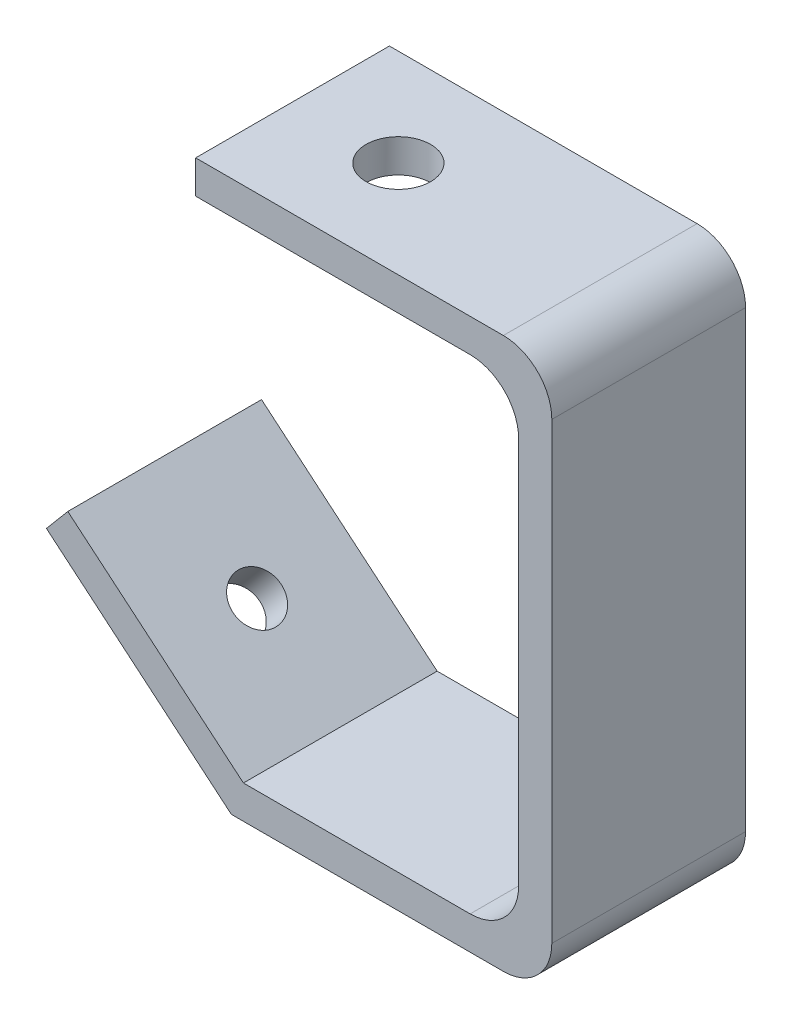
ISO-10303-21;
HEADER;
FILE_DESCRIPTION(('STEP AP214'),'2;1');
FILE_NAME('part.step','',(''),(''),'','','');
FILE_SCHEMA(('AUTOMOTIVE_DESIGN { 1 0 10303 214 1 1 1 1 }'));
ENDSEC;
DATA;
#1=APPLICATION_CONTEXT('core data for automotive mechanical design processes');
#2=APPLICATION_PROTOCOL_DEFINITION('international standard','automotive_design',2000,#1);
#3=PRODUCT_CONTEXT('',#1,'mechanical');
#4=PRODUCT('Part','Part','',(#3));
#5=PRODUCT_RELATED_PRODUCT_CATEGORY('part','',(#4));
#6=PRODUCT_DEFINITION_FORMATION('','',#4);
#7=PRODUCT_DEFINITION_CONTEXT('part definition',#1,'design');
#8=PRODUCT_DEFINITION('design','',#6,#7);
#9=PRODUCT_DEFINITION_SHAPE('','',#8);
#10=(LENGTH_UNIT() NAMED_UNIT(*) SI_UNIT(.MILLI.,.METRE.));
#11=(NAMED_UNIT(*) PLANE_ANGLE_UNIT() SI_UNIT($,.RADIAN.));
#12=(NAMED_UNIT(*) SI_UNIT($,.STERADIAN.) SOLID_ANGLE_UNIT());
#13=UNCERTAINTY_MEASURE_WITH_UNIT(LENGTH_MEASURE(1.E-05),#10,'distance_accuracy_value','');
#14=(GEOMETRIC_REPRESENTATION_CONTEXT(3) GLOBAL_UNCERTAINTY_ASSIGNED_CONTEXT((#13)) GLOBAL_UNIT_ASSIGNED_CONTEXT((#10,
#11,#12)) REPRESENTATION_CONTEXT('',''));
#15=CARTESIAN_POINT('',(0.,0.,0.));
#16=DIRECTION('',(0.,0.,1.));
#17=DIRECTION('',(1.,0.,0.));
#18=AXIS2_PLACEMENT_3D('',#15,#16,#17);
#19=CARTESIAN_POINT('',(0.,0.,38.1));
#20=DIRECTION('',(-0.642787609686535,-0.766044443118982,0.));
#21=DIRECTION('',(0.766044443118982,-0.642787609686535,0.));
#22=AXIS2_PLACEMENT_3D('',#19,#20,#21);
#23=PLANE('',#22);
#24=CARTESIAN_POINT('',(-16.36013323937,13.7277817671664,19.05));
#25=DIRECTION('',(-0.642787609686535,-0.766044443118982,0.));
#26=DIRECTION('',(0.766044443118982,-0.642787609686535,0.));
#27=AXIS2_PLACEMENT_3D('',#24,#25,#26);
#28=CIRCLE('',#27,4.765);
#29=CARTESIAN_POINT('',(-12.7099314679081,10.6648988070101,19.05));
#30=VERTEX_POINT('',#29);
#31=EDGE_CURVE('E333',#30,#30,#28,.T.);
#32=ORIENTED_EDGE('',*,*,#31,.T.);
#33=EDGE_LOOP('',(#32));
#34=FACE_BOUND('',#33,.T.);
#35=DIRECTION('',(-0.766044443118982,0.642787609686535,0.));
#36=VECTOR('',#35,1.);
#37=CARTESIAN_POINT('',(0.,0.,0.));
#38=LINE('',#37,#36);
#39=CARTESIAN_POINT('',(0.,0.,0.));
#40=VERTEX_POINT('',#39);
#41=CARTESIAN_POINT('',(-34.5409439402349,28.9832933207658,0.));
#42=VERTEX_POINT('',#41);
#43=EDGE_CURVE('E177',#40,#42,#38,.T.);
#44=ORIENTED_EDGE('',*,*,#43,.T.);
#45=DIRECTION('',(0.,0.,-1.));
#46=VECTOR('',#45,1.);
#47=CARTESIAN_POINT('',(-34.5409439402349,28.9832933207658,38.1));
#48=LINE('',#47,#46);
#49=CARTESIAN_POINT('',(-34.5409439402349,28.9832933207658,38.1));
#50=VERTEX_POINT('',#49);
#51=EDGE_CURVE('E11',#50,#42,#48,.T.);
#52=ORIENTED_EDGE('',*,*,#51,.F.);
#53=DIRECTION('',(-0.766044443118982,0.642787609686535,0.));
#54=VECTOR('',#53,1.);
#55=CARTESIAN_POINT('',(0.,0.,38.1));
#56=LINE('',#55,#54);
#57=CARTESIAN_POINT('',(0.,0.,38.1));
#58=VERTEX_POINT('',#57);
#59=EDGE_CURVE('E217',#58,#50,#56,.T.);
#60=ORIENTED_EDGE('',*,*,#59,.F.);
#61=DIRECTION('',(0.,0.,-1.));
#62=VECTOR('',#61,1.);
#63=CARTESIAN_POINT('',(0.,0.,38.1));
#64=LINE('',#63,#62);
#65=EDGE_CURVE('E173',#58,#40,#64,.T.);
#66=ORIENTED_EDGE('',*,*,#65,.T.);
#67=EDGE_LOOP('',(#44,#52,#60,#66));
#68=FACE_BOUND('',#67,.T.);
#69=ADVANCED_FACE('F39',(#34,#68),#23,.F.);
#70=CARTESIAN_POINT('',(-34.5409439402349,28.9832933207658,38.1));
#71=DIRECTION('',(0.766044443118982,-0.642787609686535,0.));
#72=DIRECTION('',(0.642787609686535,0.766044443118982,0.));
#73=AXIS2_PLACEMENT_3D('',#70,#71,#72);
#74=PLANE('',#73);
#75=DIRECTION('',(-0.642787609686535,-0.766044443118982,0.));
#76=VECTOR('',#75,1.);
#77=CARTESIAN_POINT('',(-34.5409439402349,28.9832933207658,0.));
#78=LINE('',#77,#76);
#79=CARTESIAN_POINT('',(-38.738347031488,23.9810231071989,0.));
#80=VERTEX_POINT('',#79);
#81=EDGE_CURVE('E181',#42,#80,#78,.T.);
#82=ORIENTED_EDGE('',*,*,#81,.T.);
#83=DIRECTION('',(0.,0.,-1.));
#84=VECTOR('',#83,1.);
#85=CARTESIAN_POINT('',(-38.738347031488,23.9810231071989,38.1));
#86=LINE('',#85,#84);
#87=CARTESIAN_POINT('',(-38.738347031488,23.9810231071989,38.1));
#88=VERTEX_POINT('',#87);
#89=EDGE_CURVE('E49',#88,#80,#86,.T.);
#90=ORIENTED_EDGE('',*,*,#89,.F.);
#91=DIRECTION('',(-0.642787609686535,-0.766044443118982,0.));
#92=VECTOR('',#91,1.);
#93=CARTESIAN_POINT('',(-34.5409439402349,28.9832933207658,38.1));
#94=LINE('',#93,#92);
#95=EDGE_CURVE('E118',#50,#88,#94,.T.);
#96=ORIENTED_EDGE('',*,*,#95,.F.);
#97=ORIENTED_EDGE('',*,*,#51,.T.);
#98=EDGE_LOOP('',(#82,#90,#96,#97));
#99=FACE_BOUND('',#98,.T.);
#100=ADVANCED_FACE('F326',(#99),#74,.F.);
#101=CARTESIAN_POINT('',(-2.37672562975828,-6.53,38.1));
#102=DIRECTION('',(0.642787609686535,0.766044443118982,0.));
#103=DIRECTION('',(-0.766044443118982,0.642787609686535,0.));
#104=AXIS2_PLACEMENT_3D('',#101,#102,#103);
#105=PLANE('',#104);
#106=CARTESIAN_POINT('',(-20.5575363306231,8.72551155359944,19.05));
#107=DIRECTION('',(-0.642787609686535,-0.766044443118982,0.));
#108=DIRECTION('',(0.766044443118982,-0.642787609686535,0.));
#109=AXIS2_PLACEMENT_3D('',#106,#107,#108);
#110=CIRCLE('',#109,4.765);
#111=CARTESIAN_POINT('',(-16.9073345591612,5.6626285934431,19.05));
#112=VERTEX_POINT('',#111);
#113=EDGE_CURVE('E337',#112,#112,#110,.T.);
#114=ORIENTED_EDGE('',*,*,#113,.F.);
#115=EDGE_LOOP('',(#114));
#116=FACE_BOUND('',#115,.T.);
#117=DIRECTION('',(0.766044443118982,-0.642787609686535,0.));
#118=VECTOR('',#117,1.);
#119=CARTESIAN_POINT('',(-2.37672562975828,-6.53,0.));
#120=LINE('',#119,#118);
#121=CARTESIAN_POINT('',(-2.37672562975828,-6.53,0.));
#122=VERTEX_POINT('',#121);
#123=EDGE_CURVE('E184',#80,#122,#120,.T.);
#124=ORIENTED_EDGE('',*,*,#123,.T.);
#125=DIRECTION('',(0.,0.,-1.));
#126=VECTOR('',#125,1.);
#127=CARTESIAN_POINT('',(-2.37672562975828,-6.53,38.1));
#128=LINE('',#127,#126);
#129=CARTESIAN_POINT('',(-2.37672562975828,-6.53,38.1));
#130=VERTEX_POINT('',#129);
#131=EDGE_CURVE('E252',#130,#122,#128,.T.);
#132=ORIENTED_EDGE('',*,*,#131,.F.);
#133=DIRECTION('',(0.766044443118982,-0.642787609686535,0.));
#134=VECTOR('',#133,1.);
#135=CARTESIAN_POINT('',(-2.37672562975828,-6.53,38.1));
#136=LINE('',#135,#134);
#137=EDGE_CURVE('E263',#88,#130,#136,.T.);
#138=ORIENTED_EDGE('',*,*,#137,.F.);
#139=ORIENTED_EDGE('',*,*,#89,.T.);
#140=EDGE_LOOP('',(#124,#132,#138,#139));
#141=FACE_BOUND('',#140,.T.);
#142=ADVANCED_FACE('F261',(#116,#141),#105,.F.);
#143=CARTESIAN_POINT('',(-2.37672562975828,-6.53,38.1));
#144=DIRECTION('',(0.,1.,0.));
#145=DIRECTION('',(0.,0.,1.));
#146=AXIS2_PLACEMENT_3D('',#143,#144,#145);
#147=PLANE('',#146);
#148=DIRECTION('',(1.,0.,0.));
#149=VECTOR('',#148,1.);
#150=CARTESIAN_POINT('',(-2.37672562975828,-6.53,0.));
#151=LINE('',#150,#149);
#152=CARTESIAN_POINT('',(51.1209999999999,-6.53,0.));
#153=VERTEX_POINT('',#152);
#154=EDGE_CURVE('E187',#122,#153,#151,.T.);
#155=ORIENTED_EDGE('',*,*,#154,.T.);
#156=DIRECTION('',(0.,0.,-1.));
#157=VECTOR('',#156,1.);
#158=CARTESIAN_POINT('',(51.1209999999999,-6.53,38.1));
#159=LINE('',#158,#157);
#160=CARTESIAN_POINT('',(51.1209999999999,-6.53,38.1));
#161=VERTEX_POINT('',#160);
#162=EDGE_CURVE('E248',#161,#153,#159,.T.);
#163=ORIENTED_EDGE('',*,*,#162,.F.);
#164=DIRECTION('',(1.,0.,0.));
#165=VECTOR('',#164,1.);
#166=CARTESIAN_POINT('',(-2.37672562975828,-6.53,38.1));
#167=LINE('',#166,#165);
#168=EDGE_CURVE('E282',#130,#161,#167,.T.);
#169=ORIENTED_EDGE('',*,*,#168,.F.);
#170=ORIENTED_EDGE('',*,*,#131,.T.);
#171=EDGE_LOOP('',(#155,#163,#169,#170));
#172=FACE_BOUND('',#171,.T.);
#173=ADVANCED_FACE('F272',(#172),#147,.F.);
#174=CARTESIAN_POINT('',(51.121,3.,38.1));
#175=DIRECTION('',(0.,0.,-1.));
#176=DIRECTION('',(-1.,0.,0.));
#177=AXIS2_PLACEMENT_3D('',#174,#175,#176);
#178=CYLINDRICAL_SURFACE('',#177,9.53);
#179=CARTESIAN_POINT('',(51.121,3.,0.));
#180=DIRECTION('',(0.,0.,1.));
#181=DIRECTION('',(1.,0.,0.));
#182=AXIS2_PLACEMENT_3D('',#179,#180,#181);
#183=CIRCLE('',#182,9.53);
#184=CARTESIAN_POINT('',(60.651,3.00000000000007,0.));
#185=VERTEX_POINT('',#184);
#186=EDGE_CURVE('E190',#153,#185,#183,.T.);
#187=ORIENTED_EDGE('',*,*,#186,.T.);
#188=DIRECTION('',(0.,0.,-1.));
#189=VECTOR('',#188,1.);
#190=CARTESIAN_POINT('',(60.651,3.00000000000007,38.1));
#191=LINE('',#190,#189);
#192=CARTESIAN_POINT('',(60.651,3.00000000000007,38.1));
#193=VERTEX_POINT('',#192);
#194=EDGE_CURVE('E244',#193,#185,#191,.T.);
#195=ORIENTED_EDGE('',*,*,#194,.F.);
#196=CARTESIAN_POINT('',(51.121,3.,38.1));
#197=DIRECTION('',(0.,0.,1.));
#198=DIRECTION('',(1.,0.,0.));
#199=AXIS2_PLACEMENT_3D('',#196,#197,#198);
#200=CIRCLE('',#199,9.53);
#201=EDGE_CURVE('E278',#161,#193,#200,.T.);
#202=ORIENTED_EDGE('',*,*,#201,.F.);
#203=ORIENTED_EDGE('',*,*,#162,.T.);
#204=EDGE_LOOP('',(#187,#195,#202,#203));
#205=FACE_BOUND('',#204,.T.);
#206=ADVANCED_FACE('F276',(#205),#178,.T.);
#207=CARTESIAN_POINT('',(60.651,3.00000000000007,38.1));
#208=DIRECTION('',(-1.,0.,0.));
#209=DIRECTION('',(0.,0.,1.));
#210=AXIS2_PLACEMENT_3D('',#207,#208,#209);
#211=PLANE('',#210);
#212=DIRECTION('',(0.,1.,0.));
#213=VECTOR('',#212,1.);
#214=CARTESIAN_POINT('',(60.651,3.00000000000007,0.));
#215=LINE('',#214,#213);
#216=CARTESIAN_POINT('',(60.651,92.2499999999999,0.));
#217=VERTEX_POINT('',#216);
#218=EDGE_CURVE('E193',#185,#217,#215,.T.);
#219=ORIENTED_EDGE('',*,*,#218,.T.);
#220=DIRECTION('',(0.,0.,-1.));
#221=VECTOR('',#220,1.);
#222=CARTESIAN_POINT('',(60.651,92.2499999999999,38.1));
#223=LINE('',#222,#221);
#224=CARTESIAN_POINT('',(60.651,92.2499999999999,38.1));
#225=VERTEX_POINT('',#224);
#226=EDGE_CURVE('E240',#225,#217,#223,.T.);
#227=ORIENTED_EDGE('',*,*,#226,.F.);
#228=DIRECTION('',(0.,1.,0.));
#229=VECTOR('',#228,1.);
#230=CARTESIAN_POINT('',(60.651,3.00000000000007,38.1));
#231=LINE('',#230,#229);
#232=EDGE_CURVE('E281',#193,#225,#231,.T.);
#233=ORIENTED_EDGE('',*,*,#232,.F.);
#234=ORIENTED_EDGE('',*,*,#194,.T.);
#235=EDGE_LOOP('',(#219,#227,#233,#234));
#236=FACE_BOUND('',#235,.T.);
#237=ADVANCED_FACE('F391',(#236),#211,.F.);
#238=CARTESIAN_POINT('',(51.121,92.25,38.1));
#239=DIRECTION('',(0.,0.,-1.));
#240=DIRECTION('',(-1.,0.,0.));
#241=AXIS2_PLACEMENT_3D('',#238,#239,#240);
#242=CYLINDRICAL_SURFACE('',#241,9.53);
#243=CARTESIAN_POINT('',(51.121,92.25,0.));
#244=DIRECTION('',(0.,0.,1.));
#245=DIRECTION('',(1.,0.,0.));
#246=AXIS2_PLACEMENT_3D('',#243,#244,#245);
#247=CIRCLE('',#246,9.53);
#248=CARTESIAN_POINT('',(51.1209999999999,101.78,0.));
#249=VERTEX_POINT('',#248);
#250=EDGE_CURVE('E196',#217,#249,#247,.T.);
#251=ORIENTED_EDGE('',*,*,#250,.T.);
#252=DIRECTION('',(0.,0.,-1.));
#253=VECTOR('',#252,1.);
#254=CARTESIAN_POINT('',(51.1209999999999,101.78,38.1));
#255=LINE('',#254,#253);
#256=CARTESIAN_POINT('',(51.1209999999999,101.78,38.1));
#257=VERTEX_POINT('',#256);
#258=EDGE_CURVE('E236',#257,#249,#255,.T.);
#259=ORIENTED_EDGE('',*,*,#258,.F.);
#260=CARTESIAN_POINT('',(51.121,92.25,38.1));
#261=DIRECTION('',(0.,0.,1.));
#262=DIRECTION('',(1.,0.,0.));
#263=AXIS2_PLACEMENT_3D('',#260,#261,#262);
#264=CIRCLE('',#263,9.53);
#265=EDGE_CURVE('E286',#225,#257,#264,.T.);
#266=ORIENTED_EDGE('',*,*,#265,.F.);
#267=ORIENTED_EDGE('',*,*,#226,.T.);
#268=EDGE_LOOP('',(#251,#259,#266,#267));
#269=FACE_BOUND('',#268,.T.);
#270=ADVANCED_FACE('F372',(#269),#242,.T.);
#271=CARTESIAN_POINT('',(51.1209999999999,101.78,38.1));
#272=DIRECTION('',(0.,-1.,0.));
#273=DIRECTION('',(0.,0.,-1.));
#274=AXIS2_PLACEMENT_3D('',#271,#272,#273);
#275=PLANE('',#274);
#276=CARTESIAN_POINT('',(11.421,101.78,19.05));
#277=DIRECTION('',(0.,1.,0.));
#278=DIRECTION('',(0.,0.,1.));
#279=AXIS2_PLACEMENT_3D('',#276,#277,#278);
#280=CIRCLE('',#279,6.35);
#281=CARTESIAN_POINT('',(11.421,101.78,25.4));
#282=VERTEX_POINT('',#281);
#283=EDGE_CURVE('E336',#282,#282,#280,.T.);
#284=ORIENTED_EDGE('',*,*,#283,.F.);
#285=EDGE_LOOP('',(#284));
#286=FACE_BOUND('',#285,.T.);
#287=DIRECTION('',(-1.,0.,0.));
#288=VECTOR('',#287,1.);
#289=CARTESIAN_POINT('',(51.1209999999999,101.78,0.));
#290=LINE('',#289,#288);
#291=CARTESIAN_POINT('',(-9.38899999999999,101.78,0.));
#292=VERTEX_POINT('',#291);
#293=EDGE_CURVE('E199',#249,#292,#290,.T.);
#294=ORIENTED_EDGE('',*,*,#293,.T.);
#295=DIRECTION('',(0.,0.,-1.));
#296=VECTOR('',#295,1.);
#297=CARTESIAN_POINT('',(-9.38899999999999,101.78,38.1));
#298=LINE('',#297,#296);
#299=CARTESIAN_POINT('',(-9.38899999999999,101.78,38.1));
#300=VERTEX_POINT('',#299);
#301=EDGE_CURVE('E232',#300,#292,#298,.T.);
#302=ORIENTED_EDGE('',*,*,#301,.F.);
#303=DIRECTION('',(-1.,0.,0.));
#304=VECTOR('',#303,1.);
#305=CARTESIAN_POINT('',(51.1209999999999,101.78,38.1));
#306=LINE('',#305,#304);
#307=EDGE_CURVE('E293',#257,#300,#306,.T.);
#308=ORIENTED_EDGE('',*,*,#307,.F.);
#309=ORIENTED_EDGE('',*,*,#258,.T.);
#310=EDGE_LOOP('',(#294,#302,#308,#309));
#311=FACE_BOUND('',#310,.T.);
#312=ADVANCED_FACE('F368',(#286,#311),#275,.F.);
#313=CARTESIAN_POINT('',(-9.38899999999999,101.78,38.1));
#314=DIRECTION('',(1.,0.,0.));
#315=DIRECTION('',(0.,0.,-1.));
#316=AXIS2_PLACEMENT_3D('',#313,#314,#315);
#317=PLANE('',#316);
#318=DIRECTION('',(0.,-1.,0.));
#319=VECTOR('',#318,1.);
#320=CARTESIAN_POINT('',(-9.38899999999999,101.78,0.));
#321=LINE('',#320,#319);
#322=CARTESIAN_POINT('',(-9.38899999999999,95.25,0.));
#323=VERTEX_POINT('',#322);
#324=EDGE_CURVE('E202',#292,#323,#321,.T.);
#325=ORIENTED_EDGE('',*,*,#324,.T.);
#326=DIRECTION('',(0.,0.,-1.));
#327=VECTOR('',#326,1.);
#328=CARTESIAN_POINT('',(-9.38899999999999,95.25,38.1));
#329=LINE('',#328,#327);
#330=CARTESIAN_POINT('',(-9.38899999999999,95.25,38.1));
#331=VERTEX_POINT('',#330);
#332=EDGE_CURVE('E228',#331,#323,#329,.T.);
#333=ORIENTED_EDGE('',*,*,#332,.F.);
#334=DIRECTION('',(0.,-1.,0.));
#335=VECTOR('',#334,1.);
#336=CARTESIAN_POINT('',(-9.38899999999999,101.78,38.1));
#337=LINE('',#336,#335);
#338=EDGE_CURVE('E296',#300,#331,#337,.T.);
#339=ORIENTED_EDGE('',*,*,#338,.F.);
#340=ORIENTED_EDGE('',*,*,#301,.T.);
#341=EDGE_LOOP('',(#325,#333,#339,#340));
#342=FACE_BOUND('',#341,.T.);
#343=ADVANCED_FACE('F371',(#342),#317,.F.);
#344=CARTESIAN_POINT('',(44.5909999999999,95.25,38.1));
#345=DIRECTION('',(0.,1.,0.));
#346=DIRECTION('',(-1.,0.,0.));
#347=AXIS2_PLACEMENT_3D('',#344,#345,#346);
#348=PLANE('',#347);
#349=CARTESIAN_POINT('',(11.421,95.25,19.05));
#350=DIRECTION('',(0.,1.,0.));
#351=DIRECTION('',(-1.,0.,0.));
#352=AXIS2_PLACEMENT_3D('',#349,#350,#351);
#353=CIRCLE('',#352,6.35);
#354=CARTESIAN_POINT('',(5.071,95.25,19.05));
#355=VERTEX_POINT('',#354);
#356=EDGE_CURVE('E42',#355,#355,#353,.T.);
#357=ORIENTED_EDGE('',*,*,#356,.T.);
#358=EDGE_LOOP('',(#357));
#359=FACE_BOUND('',#358,.T.);
#360=DIRECTION('',(1.,0.,0.));
#361=VECTOR('',#360,1.);
#362=CARTESIAN_POINT('',(44.5909999999999,95.25,0.));
#363=LINE('',#362,#361);
#364=CARTESIAN_POINT('',(44.5909999999999,95.25,0.));
#365=VERTEX_POINT('',#364);
#366=EDGE_CURVE('E205',#323,#365,#363,.T.);
#367=ORIENTED_EDGE('',*,*,#366,.T.);
#368=DIRECTION('',(0.,0.,-1.));
#369=VECTOR('',#368,1.);
#370=CARTESIAN_POINT('',(44.5909999999999,95.25,38.1));
#371=LINE('',#370,#369);
#372=CARTESIAN_POINT('',(44.5909999999999,95.25,38.1));
#373=VERTEX_POINT('',#372);
#374=EDGE_CURVE('E224',#373,#365,#371,.T.);
#375=ORIENTED_EDGE('',*,*,#374,.F.);
#376=DIRECTION('',(1.,0.,0.));
#377=VECTOR('',#376,1.);
#378=CARTESIAN_POINT('',(44.5909999999999,95.25,38.1));
#379=LINE('',#378,#377);
#380=EDGE_CURVE('E299',#331,#373,#379,.T.);
#381=ORIENTED_EDGE('',*,*,#380,.F.);
#382=ORIENTED_EDGE('',*,*,#332,.T.);
#383=EDGE_LOOP('',(#367,#375,#381,#382));
#384=FACE_BOUND('',#383,.T.);
#385=ADVANCED_FACE('F307',(#359,#384),#348,.F.);
#386=CARTESIAN_POINT('',(44.591,85.72,38.1));
#387=DIRECTION('',(0.,0.,-1.));
#388=DIRECTION('',(-1.,0.,0.));
#389=AXIS2_PLACEMENT_3D('',#386,#387,#388);
#390=CYLINDRICAL_SURFACE('',#389,9.53);
#391=CARTESIAN_POINT('',(44.591,85.72,0.));
#392=DIRECTION('',(0.,0.,-1.));
#393=DIRECTION('',(1.,0.,0.));
#394=AXIS2_PLACEMENT_3D('',#391,#392,#393);
#395=CIRCLE('',#394,9.53);
#396=CARTESIAN_POINT('',(54.121,85.7199999999999,0.));
#397=VERTEX_POINT('',#396);
#398=EDGE_CURVE('E208',#365,#397,#395,.T.);
#399=ORIENTED_EDGE('',*,*,#398,.T.);
#400=DIRECTION('',(0.,0.,-1.));
#401=VECTOR('',#400,1.);
#402=CARTESIAN_POINT('',(54.121,85.7199999999999,38.1));
#403=LINE('',#402,#401);
#404=CARTESIAN_POINT('',(54.121,85.7199999999999,38.1));
#405=VERTEX_POINT('',#404);
#406=EDGE_CURVE('E166',#405,#397,#403,.T.);
#407=ORIENTED_EDGE('',*,*,#406,.F.);
#408=CARTESIAN_POINT('',(44.591,85.72,38.1));
#409=DIRECTION('',(0.,0.,-1.));
#410=DIRECTION('',(1.,0.,0.));
#411=AXIS2_PLACEMENT_3D('',#408,#409,#410);
#412=CIRCLE('',#411,9.53);
#413=EDGE_CURVE('E155',#373,#405,#412,.T.);
#414=ORIENTED_EDGE('',*,*,#413,.F.);
#415=ORIENTED_EDGE('',*,*,#374,.T.);
#416=EDGE_LOOP('',(#399,#407,#414,#415));
#417=FACE_BOUND('',#416,.T.);
#418=ADVANCED_FACE('F311',(#417),#390,.F.);
#419=CARTESIAN_POINT('',(54.121,9.53000000000008,38.1));
#420=DIRECTION('',(1.,0.,0.));
#421=DIRECTION('',(0.,0.,-1.));
#422=AXIS2_PLACEMENT_3D('',#419,#420,#421);
#423=PLANE('',#422);
#424=DIRECTION('',(0.,-1.,0.));
#425=VECTOR('',#424,1.);
#426=CARTESIAN_POINT('',(54.121,9.53000000000008,0.));
#427=LINE('',#426,#425);
#428=CARTESIAN_POINT('',(54.121,9.53000000000001,0.));
#429=VERTEX_POINT('',#428);
#430=EDGE_CURVE('E164',#397,#429,#427,.T.);
#431=ORIENTED_EDGE('',*,*,#430,.T.);
#432=DIRECTION('',(0.,0.,-1.));
#433=VECTOR('',#432,1.);
#434=CARTESIAN_POINT('',(54.121,9.53000000000001,38.1));
#435=LINE('',#434,#433);
#436=CARTESIAN_POINT('',(54.121,9.53000000000001,38.1));
#437=VERTEX_POINT('',#436);
#438=EDGE_CURVE('E161',#437,#429,#435,.T.);
#439=ORIENTED_EDGE('',*,*,#438,.F.);
#440=DIRECTION('',(0.,-1.,0.));
#441=VECTOR('',#440,1.);
#442=CARTESIAN_POINT('',(54.121,9.53000000000008,38.1));
#443=LINE('',#442,#441);
#444=EDGE_CURVE('E149',#405,#437,#443,.T.);
#445=ORIENTED_EDGE('',*,*,#444,.F.);
#446=ORIENTED_EDGE('',*,*,#406,.T.);
#447=EDGE_LOOP('',(#431,#439,#445,#446));
#448=FACE_BOUND('',#447,.T.);
#449=ADVANCED_FACE('F162',(#448),#423,.F.);
#450=CARTESIAN_POINT('',(44.591,9.53000000000001,38.1));
#451=DIRECTION('',(0.,0.,-1.));
#452=DIRECTION('',(-1.,0.,0.));
#453=AXIS2_PLACEMENT_3D('',#450,#451,#452);
#454=CYLINDRICAL_SURFACE('',#453,9.53);
#455=CARTESIAN_POINT('',(44.591,9.53000000000001,0.));
#456=DIRECTION('',(0.,0.,-1.));
#457=DIRECTION('',(1.,0.,0.));
#458=AXIS2_PLACEMENT_3D('',#455,#456,#457);
#459=CIRCLE('',#458,9.53);
#460=CARTESIAN_POINT('',(44.5909999999999,0.,0.));
#461=VERTEX_POINT('',#460);
#462=EDGE_CURVE('E104',#429,#461,#459,.T.);
#463=ORIENTED_EDGE('',*,*,#462,.T.);
#464=DIRECTION('',(0.,0.,-1.));
#465=VECTOR('',#464,1.);
#466=CARTESIAN_POINT('',(44.5909999999999,0.,38.1));
#467=LINE('',#466,#465);
#468=CARTESIAN_POINT('',(44.5909999999999,0.,38.1));
#469=VERTEX_POINT('',#468);
#470=EDGE_CURVE('E167',#469,#461,#467,.T.);
#471=ORIENTED_EDGE('',*,*,#470,.F.);
#472=CARTESIAN_POINT('',(44.591,9.53000000000001,38.1));
#473=DIRECTION('',(0.,0.,-1.));
#474=DIRECTION('',(1.,0.,0.));
#475=AXIS2_PLACEMENT_3D('',#472,#473,#474);
#476=CIRCLE('',#475,9.53);
#477=EDGE_CURVE('E153',#437,#469,#476,.T.);
#478=ORIENTED_EDGE('',*,*,#477,.F.);
#479=ORIENTED_EDGE('',*,*,#438,.T.);
#480=EDGE_LOOP('',(#463,#471,#478,#479));
#481=FACE_BOUND('',#480,.T.);
#482=ADVANCED_FACE('F169',(#481),#454,.F.);
#483=CARTESIAN_POINT('',(0.,0.,38.1));
#484=DIRECTION('',(0.,-1.,0.));
#485=DIRECTION('',(1.,0.,0.));
#486=AXIS2_PLACEMENT_3D('',#483,#484,#485);
#487=PLANE('',#486);
#488=DIRECTION('',(-1.,0.,0.));
#489=VECTOR('',#488,1.);
#490=CARTESIAN_POINT('',(0.,0.,0.));
#491=LINE('',#490,#489);
#492=EDGE_CURVE('E110',#461,#40,#491,.T.);
#493=ORIENTED_EDGE('',*,*,#492,.T.);
#494=ORIENTED_EDGE('',*,*,#65,.F.);
#495=DIRECTION('',(-1.,0.,0.));
#496=VECTOR('',#495,1.);
#497=CARTESIAN_POINT('',(0.,0.,38.1));
#498=LINE('',#497,#496);
#499=EDGE_CURVE('E57',#469,#58,#498,.T.);
#500=ORIENTED_EDGE('',*,*,#499,.F.);
#501=ORIENTED_EDGE('',*,*,#470,.T.);
#502=EDGE_LOOP('',(#493,#494,#500,#501));
#503=FACE_BOUND('',#502,.T.);
#504=ADVANCED_FACE('F315',(#503),#487,.F.);
#505=CARTESIAN_POINT('',(51.121,3.,38.1));
#506=DIRECTION('',(0.,0.,1.));
#507=DIRECTION('',(1.,0.,0.));
#508=AXIS2_PLACEMENT_3D('',#505,#506,#507);
#509=PLANE('',#508);
#510=ORIENTED_EDGE('',*,*,#59,.T.);
#511=ORIENTED_EDGE('',*,*,#95,.T.);
#512=ORIENTED_EDGE('',*,*,#137,.T.);
#513=ORIENTED_EDGE('',*,*,#168,.T.);
#514=ORIENTED_EDGE('',*,*,#201,.T.);
#515=ORIENTED_EDGE('',*,*,#232,.T.);
#516=ORIENTED_EDGE('',*,*,#265,.T.);
#517=ORIENTED_EDGE('',*,*,#307,.T.);
#518=ORIENTED_EDGE('',*,*,#338,.T.);
#519=ORIENTED_EDGE('',*,*,#380,.T.);
#520=ORIENTED_EDGE('',*,*,#413,.T.);
#521=ORIENTED_EDGE('',*,*,#444,.T.);
#522=ORIENTED_EDGE('',*,*,#477,.T.);
#523=ORIENTED_EDGE('',*,*,#499,.T.);
#524=EDGE_LOOP('',(#510,#511,#512,#513,#514,#515,#516,#517,#518,#519,#520,#521,#522,#523));
#525=FACE_BOUND('',#524,.T.);
#526=ADVANCED_FACE('F151',(#525),#509,.T.);
#527=CARTESIAN_POINT('',(51.121,3.,0.));
#528=DIRECTION('',(0.,0.,1.));
#529=DIRECTION('',(1.,0.,0.));
#530=AXIS2_PLACEMENT_3D('',#527,#528,#529);
#531=PLANE('',#530);
#532=ORIENTED_EDGE('',*,*,#43,.F.);
#533=ORIENTED_EDGE('',*,*,#492,.F.);
#534=ORIENTED_EDGE('',*,*,#462,.F.);
#535=ORIENTED_EDGE('',*,*,#430,.F.);
#536=ORIENTED_EDGE('',*,*,#398,.F.);
#537=ORIENTED_EDGE('',*,*,#366,.F.);
#538=ORIENTED_EDGE('',*,*,#324,.F.);
#539=ORIENTED_EDGE('',*,*,#293,.F.);
#540=ORIENTED_EDGE('',*,*,#250,.F.);
#541=ORIENTED_EDGE('',*,*,#218,.F.);
#542=ORIENTED_EDGE('',*,*,#186,.F.);
#543=ORIENTED_EDGE('',*,*,#154,.F.);
#544=ORIENTED_EDGE('',*,*,#123,.F.);
#545=ORIENTED_EDGE('',*,*,#81,.F.);
#546=EDGE_LOOP('',(#532,#533,#534,#535,#536,#537,#538,#539,#540,#541,#542,#543,#544,#545));
#547=FACE_BOUND('',#546,.T.);
#548=ADVANCED_FACE('F267',(#547),#531,.F.);
#549=CARTESIAN_POINT('',(11.421,15.68,19.05));
#550=DIRECTION('',(0.,1.,0.));
#551=DIRECTION('',(0.,0.,1.));
#552=AXIS2_PLACEMENT_3D('',#549,#550,#551);
#553=CYLINDRICAL_SURFACE('',#552,6.35);
#554=ORIENTED_EDGE('',*,*,#283,.T.);
#555=EDGE_LOOP('',(#554));
#556=FACE_BOUND('',#555,.T.);
#557=ORIENTED_EDGE('',*,*,#356,.F.);
#558=EDGE_LOOP('',(#557));
#559=FACE_BOUND('',#558,.T.);
#560=ADVANCED_FACE('F355',(#556,#559),#553,.F.);
#561=CARTESIAN_POINT('',(-14.7081690824756,15.6965159859822,19.05));
#562=DIRECTION('',(-0.642787609686535,-0.766044443118982,0.));
#563=DIRECTION('',(0.766044443118982,-0.642787609686535,0.));
#564=AXIS2_PLACEMENT_3D('',#561,#562,#563);
#565=CYLINDRICAL_SURFACE('',#564,4.765);
#566=ORIENTED_EDGE('',*,*,#113,.T.);
#567=EDGE_LOOP('',(#566));
#568=FACE_BOUND('',#567,.T.);
#569=ORIENTED_EDGE('',*,*,#31,.F.);
#570=EDGE_LOOP('',(#569));
#571=FACE_BOUND('',#570,.T.);
#572=ADVANCED_FACE('F357',(#568,#571),#565,.F.);
#573=CLOSED_SHELL('',(#69,#100,#142,#173,#206,#237,#270,#312,#343,#385,#418,#449,#482,#504,#526,
#548,#560,#572));
#574=MANIFOLD_SOLID_BREP('B2',#573);
#575=ADVANCED_BREP_SHAPE_REPRESENTATION('',(#18,#574),#14);
#576=SHAPE_DEFINITION_REPRESENTATION(#9,#575);
ENDSEC;
END-ISO-10303-21;
